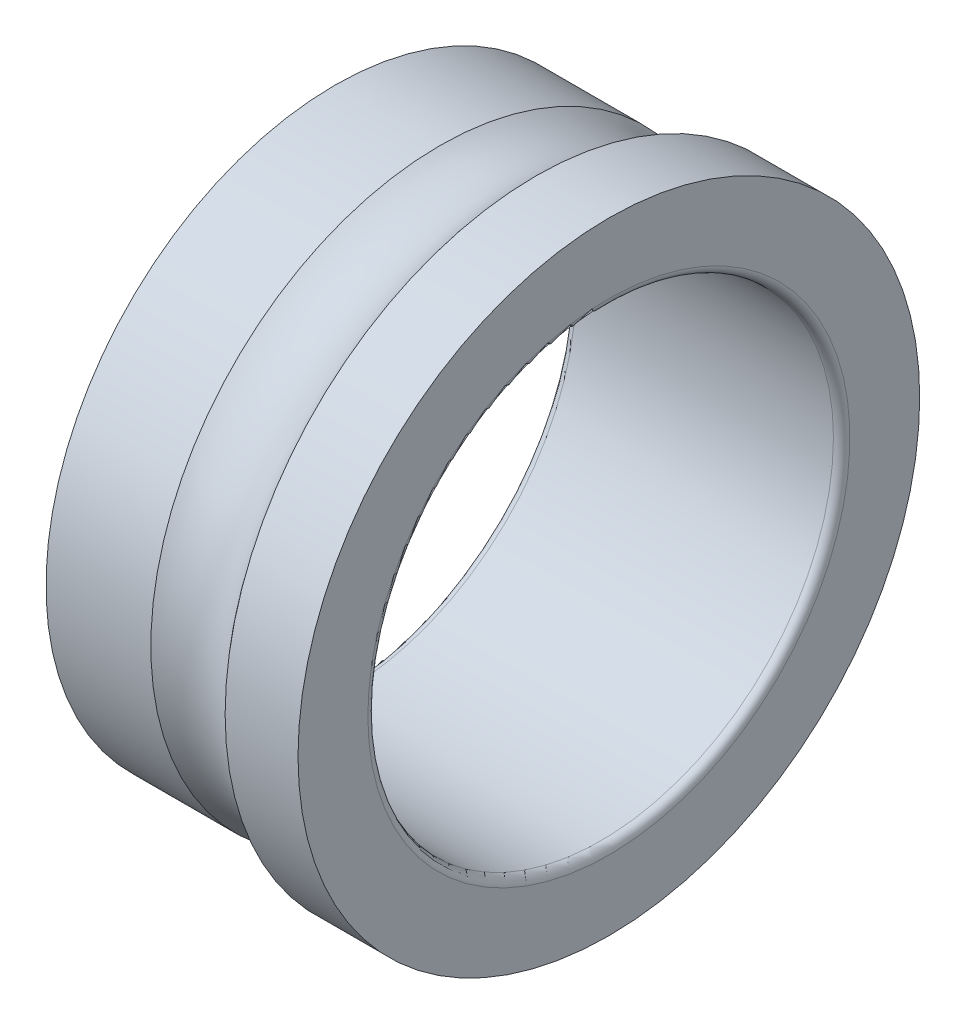
ISO-10303-21;
HEADER;
FILE_DESCRIPTION(('STEP AP214'),'2;1');
FILE_NAME('part.step','',(''),(''),'','','');
FILE_SCHEMA(('AUTOMOTIVE_DESIGN { 1 0 10303 214 1 1 1 1 }'));
ENDSEC;
DATA;
#1=APPLICATION_CONTEXT('core data for automotive mechanical design processes');
#2=APPLICATION_PROTOCOL_DEFINITION('international standard','automotive_design',2000,#1);
#3=PRODUCT_CONTEXT('',#1,'mechanical');
#4=PRODUCT('Part','Part','',(#3));
#5=PRODUCT_RELATED_PRODUCT_CATEGORY('part','',(#4));
#6=PRODUCT_DEFINITION_FORMATION('','',#4);
#7=PRODUCT_DEFINITION_CONTEXT('part definition',#1,'design');
#8=PRODUCT_DEFINITION('design','',#6,#7);
#9=PRODUCT_DEFINITION_SHAPE('','',#8);
#10=(LENGTH_UNIT() NAMED_UNIT(*) SI_UNIT(.MILLI.,.METRE.));
#11=(NAMED_UNIT(*) PLANE_ANGLE_UNIT() SI_UNIT($,.RADIAN.));
#12=(NAMED_UNIT(*) SI_UNIT($,.STERADIAN.) SOLID_ANGLE_UNIT());
#13=UNCERTAINTY_MEASURE_WITH_UNIT(LENGTH_MEASURE(1.E-05),#10,'distance_accuracy_value','');
#14=(GEOMETRIC_REPRESENTATION_CONTEXT(3) GLOBAL_UNCERTAINTY_ASSIGNED_CONTEXT((#13)) GLOBAL_UNIT_ASSIGNED_CONTEXT((#10,
#11,#12)) REPRESENTATION_CONTEXT('',''));
#15=CARTESIAN_POINT('',(0.,0.,0.));
#16=DIRECTION('',(0.,0.,1.));
#17=DIRECTION('',(1.,0.,0.));
#18=AXIS2_PLACEMENT_3D('',#15,#16,#17);
#19=CARTESIAN_POINT('',(0.,9.675,0.));
#20=DIRECTION('',(-1.,0.,0.));
#21=DIRECTION('',(0.,1.,0.));
#22=AXIS2_PLACEMENT_3D('',#19,#20,#21);
#23=PLANE('',#22);
#24=CARTESIAN_POINT('',(0.,0.,0.));
#25=DIRECTION('',(1.,0.,0.));
#26=DIRECTION('',(0.,1.,0.));
#27=AXIS2_PLACEMENT_3D('',#24,#25,#26);
#28=CIRCLE('',#27,8.8);
#29=CARTESIAN_POINT('',(0.,0.,8.8));
#30=VERTEX_POINT('',#29);
#31=EDGE_CURVE('E69',#30,#30,#28,.T.);
#32=ORIENTED_EDGE('',*,*,#31,.T.);
#33=EDGE_LOOP('',(#32));
#34=FACE_BOUND('',#33,.T.);
#35=CARTESIAN_POINT('',(0.,0.,0.));
#36=DIRECTION('',(1.,0.,0.));
#37=DIRECTION('',(0.,1.,0.));
#38=AXIS2_PLACEMENT_3D('',#35,#36,#37);
#39=CIRCLE('',#38,10.55);
#40=CARTESIAN_POINT('',(0.,-10.55,0.));
#41=VERTEX_POINT('',#40);
#42=EDGE_CURVE('E75',#41,#41,#39,.T.);
#43=ORIENTED_EDGE('',*,*,#42,.F.);
#44=EDGE_LOOP('',(#43));
#45=FACE_BOUND('',#44,.T.);
#46=ADVANCED_FACE('F17',(#34,#45),#23,.T.);
#47=CARTESIAN_POINT('',(10.,10.075,0.));
#48=DIRECTION('',(1.,0.,0.));
#49=DIRECTION('',(0.,1.,0.));
#50=AXIS2_PLACEMENT_3D('',#47,#48,#49);
#51=PLANE('',#50);
#52=CARTESIAN_POINT('',(10.,0.,0.));
#53=DIRECTION('',(1.,0.,0.));
#54=DIRECTION('',(0.,1.,0.));
#55=AXIS2_PLACEMENT_3D('',#52,#53,#54);
#56=CIRCLE('',#55,8.8);
#57=CARTESIAN_POINT('',(10.,0.,8.8));
#58=VERTEX_POINT('',#57);
#59=EDGE_CURVE('E11',#58,#58,#56,.T.);
#60=ORIENTED_EDGE('',*,*,#59,.F.);
#61=EDGE_LOOP('',(#60));
#62=FACE_BOUND('',#61,.T.);
#63=CARTESIAN_POINT('',(10.,0.,0.));
#64=DIRECTION('',(1.,0.,0.));
#65=DIRECTION('',(0.,1.,0.));
#66=AXIS2_PLACEMENT_3D('',#63,#64,#65);
#67=CIRCLE('',#66,11.35);
#68=CARTESIAN_POINT('',(10.,-11.35,0.));
#69=VERTEX_POINT('',#68);
#70=EDGE_CURVE('E84',#69,#69,#67,.T.);
#71=ORIENTED_EDGE('',*,*,#70,.T.);
#72=EDGE_LOOP('',(#71));
#73=FACE_BOUND('',#72,.T.);
#74=ADVANCED_FACE('F96',(#62,#73),#51,.T.);
#75=CARTESIAN_POINT('',(9.7,0.,0.));
#76=DIRECTION('',(1.,0.,0.));
#77=DIRECTION('',(0.,0.,-1.));
#78=AXIS2_PLACEMENT_3D('',#75,#76,#77);
#79=TOROIDAL_SURFACE('',#78,8.8,0.3);
#80=ORIENTED_EDGE('',*,*,#59,.T.);
#81=EDGE_LOOP('',(#80));
#82=FACE_BOUND('',#81,.T.);
#83=CARTESIAN_POINT('',(9.7,0.,0.));
#84=DIRECTION('',(1.,0.,0.));
#85=DIRECTION('',(0.,1.,0.));
#86=AXIS2_PLACEMENT_3D('',#83,#84,#85);
#87=CIRCLE('',#86,8.5);
#88=CARTESIAN_POINT('',(9.7,0.,8.5));
#89=VERTEX_POINT('',#88);
#90=EDGE_CURVE('E21',#89,#89,#87,.T.);
#91=ORIENTED_EDGE('',*,*,#90,.F.);
#92=EDGE_LOOP('',(#91));
#93=FACE_BOUND('',#92,.T.);
#94=ADVANCED_FACE('F19',(#82,#93),#79,.T.);
#95=CARTESIAN_POINT('',(5.,0.,0.));
#96=DIRECTION('',(1.,0.,0.));
#97=DIRECTION('',(0.,1.,0.));
#98=AXIS2_PLACEMENT_3D('',#95,#96,#97);
#99=CYLINDRICAL_SURFACE('',#98,8.5);
#100=CARTESIAN_POINT('',(0.3,0.,0.));
#101=DIRECTION('',(1.,0.,0.));
#102=DIRECTION('',(0.,1.,0.));
#103=AXIS2_PLACEMENT_3D('',#100,#101,#102);
#104=CIRCLE('',#103,8.5);
#105=CARTESIAN_POINT('',(0.3,-8.5,0.));
#106=VERTEX_POINT('',#105);
#107=EDGE_CURVE('E64',#106,#106,#104,.T.);
#108=ORIENTED_EDGE('',*,*,#107,.F.);
#109=EDGE_LOOP('',(#108));
#110=FACE_BOUND('',#109,.T.);
#111=ORIENTED_EDGE('',*,*,#90,.T.);
#112=EDGE_LOOP('',(#111));
#113=FACE_BOUND('',#112,.T.);
#114=ADVANCED_FACE('F111',(#110,#113),#99,.F.);
#115=CARTESIAN_POINT('',(0.3,0.,0.));
#116=DIRECTION('',(1.,0.,0.));
#117=DIRECTION('',(0.,0.,-1.));
#118=AXIS2_PLACEMENT_3D('',#115,#116,#117);
#119=TOROIDAL_SURFACE('',#118,8.8,0.3);
#120=ORIENTED_EDGE('',*,*,#107,.T.);
#121=EDGE_LOOP('',(#120));
#122=FACE_BOUND('',#121,.T.);
#123=ORIENTED_EDGE('',*,*,#31,.F.);
#124=EDGE_LOOP('',(#123));
#125=FACE_BOUND('',#124,.T.);
#126=ADVANCED_FACE('F65',(#122,#125),#119,.T.);
#127=CARTESIAN_POINT('',(1.91332532060176,0.,0.));
#128=DIRECTION('',(1.,0.,0.));
#129=DIRECTION('',(0.,1.,0.));
#130=AXIS2_PLACEMENT_3D('',#127,#128,#129);
#131=CYLINDRICAL_SURFACE('',#130,10.55);
#132=ORIENTED_EDGE('',*,*,#42,.T.);
#133=EDGE_LOOP('',(#132));
#134=FACE_BOUND('',#133,.T.);
#135=CARTESIAN_POINT('',(3.82665064120351,0.,0.));
#136=DIRECTION('',(1.,0.,0.));
#137=DIRECTION('',(0.,1.,0.));
#138=AXIS2_PLACEMENT_3D('',#135,#136,#137);
#139=CIRCLE('',#138,10.55);
#140=CARTESIAN_POINT('',(3.82665064120351,10.55,0.));
#141=VERTEX_POINT('',#140);
#142=EDGE_CURVE('E79',#141,#141,#139,.T.);
#143=ORIENTED_EDGE('',*,*,#142,.F.);
#144=EDGE_LOOP('',(#143));
#145=FACE_BOUND('',#144,.T.);
#146=ADVANCED_FACE('F92',(#134,#145),#131,.T.);
#147=CARTESIAN_POINT('',(8.66971851090909,0.,0.));
#148=DIRECTION('',(1.,0.,0.));
#149=DIRECTION('',(0.,1.,0.));
#150=AXIS2_PLACEMENT_3D('',#147,#148,#149);
#151=CYLINDRICAL_SURFACE('',#150,11.35);
#152=CARTESIAN_POINT('',(7.33943702181818,0.,0.));
#153=DIRECTION('',(1.,0.,0.));
#154=DIRECTION('',(0.,1.,0.));
#155=AXIS2_PLACEMENT_3D('',#152,#153,#154);
#156=CIRCLE('',#155,11.35);
#157=CARTESIAN_POINT('',(7.33943702181818,-11.35,0.));
#158=VERTEX_POINT('',#157);
#159=EDGE_CURVE('E82',#158,#158,#156,.T.);
#160=ORIENTED_EDGE('',*,*,#159,.T.);
#161=EDGE_LOOP('',(#160));
#162=FACE_BOUND('',#161,.T.);
#163=ORIENTED_EDGE('',*,*,#70,.F.);
#164=EDGE_LOOP('',(#163));
#165=FACE_BOUND('',#164,.T.);
#166=ADVANCED_FACE('F109',(#162,#165),#151,.T.);
#167=CARTESIAN_POINT('',(5.11344510808623,0.,0.));
#168=DIRECTION('',(1.,0.,0.));
#169=DIRECTION('',(0.,0.,-1.));
#170=AXIS2_PLACEMENT_3D('',#167,#168,#169);
#171=TOROIDAL_SURFACE('',#170,13.012,2.778);
#172=ORIENTED_EDGE('',*,*,#159,.F.);
#173=EDGE_LOOP('',(#172));
#174=FACE_BOUND('',#173,.T.);
#175=ORIENTED_EDGE('',*,*,#142,.T.);
#176=EDGE_LOOP('',(#175));
#177=FACE_BOUND('',#176,.T.);
#178=ADVANCED_FACE('F106',(#174,#177),#171,.F.);
#179=CLOSED_SHELL('',(#46,#74,#94,#114,#126,#146,#166,#178));
#180=MANIFOLD_SOLID_BREP('B1',#179);
#181=ADVANCED_BREP_SHAPE_REPRESENTATION('',(#18,#180),#14);
#182=SHAPE_DEFINITION_REPRESENTATION(#9,#181);
ENDSEC;
END-ISO-10303-21;
